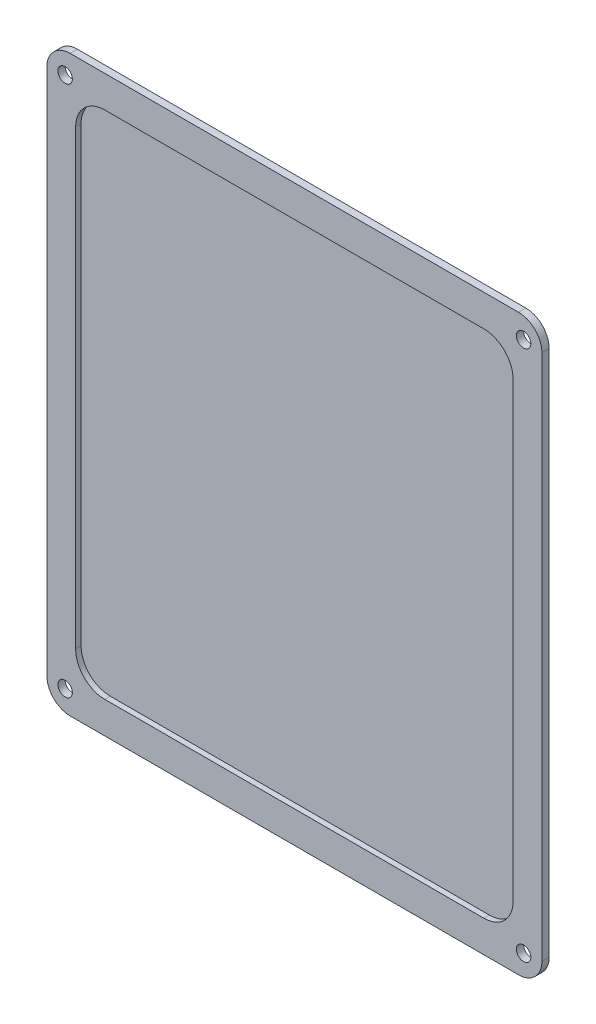
ISO-10303-21;
HEADER;
FILE_DESCRIPTION(('STEP AP214'),'2;1');
FILE_NAME('part.step','',(''),(''),'','','');
FILE_SCHEMA(('AUTOMOTIVE_DESIGN { 1 0 10303 214 1 1 1 1 }'));
ENDSEC;
DATA;
#1=APPLICATION_CONTEXT('core data for automotive mechanical design processes');
#2=APPLICATION_PROTOCOL_DEFINITION('international standard','automotive_design',2000,#1);
#3=PRODUCT_CONTEXT('',#1,'mechanical');
#4=PRODUCT('Part','Part','',(#3));
#5=PRODUCT_RELATED_PRODUCT_CATEGORY('part','',(#4));
#6=PRODUCT_DEFINITION_FORMATION('','',#4);
#7=PRODUCT_DEFINITION_CONTEXT('part definition',#1,'design');
#8=PRODUCT_DEFINITION('design','',#6,#7);
#9=PRODUCT_DEFINITION_SHAPE('','',#8);
#10=(LENGTH_UNIT() NAMED_UNIT(*) SI_UNIT(.MILLI.,.METRE.));
#11=(NAMED_UNIT(*) PLANE_ANGLE_UNIT() SI_UNIT($,.RADIAN.));
#12=(NAMED_UNIT(*) SI_UNIT($,.STERADIAN.) SOLID_ANGLE_UNIT());
#13=UNCERTAINTY_MEASURE_WITH_UNIT(LENGTH_MEASURE(1.E-05),#10,'distance_accuracy_value','');
#14=(GEOMETRIC_REPRESENTATION_CONTEXT(3) GLOBAL_UNCERTAINTY_ASSIGNED_CONTEXT((#13)) GLOBAL_UNIT_ASSIGNED_CONTEXT((#10,
#11,#12)) REPRESENTATION_CONTEXT('',''));
#15=CARTESIAN_POINT('',(0.,0.,0.));
#16=DIRECTION('',(0.,0.,1.));
#17=DIRECTION('',(1.,0.,0.));
#18=AXIS2_PLACEMENT_3D('',#15,#16,#17);
#19=CARTESIAN_POINT('',(0.,0.,0.));
#20=DIRECTION('',(0.,0.,1.));
#21=DIRECTION('',(1.,0.,0.));
#22=AXIS2_PLACEMENT_3D('',#19,#20,#21);
#23=PLANE('',#22);
#24=CARTESIAN_POINT('',(-49.911,-57.8485,0.));
#25=DIRECTION('',(0.,0.,1.));
#26=DIRECTION('',(1.,0.,0.));
#27=AXIS2_PLACEMENT_3D('',#24,#25,#26);
#28=CIRCLE('',#27,1.5748);
#29=CARTESIAN_POINT('',(-48.3362,-57.8485,0.));
#30=VERTEX_POINT('',#29);
#31=EDGE_CURVE('E226',#30,#30,#28,.T.);
#32=ORIENTED_EDGE('',*,*,#31,.T.);
#33=EDGE_LOOP('',(#32));
#34=FACE_BOUND('',#33,.T.);
#35=CARTESIAN_POINT('',(49.911,57.8485,0.));
#36=DIRECTION('',(0.,0.,1.));
#37=DIRECTION('',(1.,0.,0.));
#38=AXIS2_PLACEMENT_3D('',#35,#36,#37);
#39=CIRCLE('',#38,1.5748);
#40=CARTESIAN_POINT('',(51.4858,57.8485,0.));
#41=VERTEX_POINT('',#40);
#42=EDGE_CURVE('E233',#41,#41,#39,.T.);
#43=ORIENTED_EDGE('',*,*,#42,.T.);
#44=EDGE_LOOP('',(#43));
#45=FACE_BOUND('',#44,.T.);
#46=DIRECTION('',(1.,0.,0.));
#47=VECTOR('',#46,1.);
#48=CARTESIAN_POINT('',(53.8932238335263,-62.4640291505628,0.));
#49=LINE('',#48,#47);
#50=CARTESIAN_POINT('',(-48.8132238335262,-62.4640291505628,0.));
#51=VERTEX_POINT('',#50);
#52=CARTESIAN_POINT('',(48.8132238335263,-62.4640291505628,0.));
#53=VERTEX_POINT('',#52);
#54=EDGE_CURVE('E270',#51,#53,#49,.T.);
#55=ORIENTED_EDGE('',*,*,#54,.F.);
#56=CARTESIAN_POINT('',(-48.8132238335262,-57.3840291505628,0.));
#57=DIRECTION('',(0.,0.,1.));
#58=DIRECTION('',(1.,0.,0.));
#59=AXIS2_PLACEMENT_3D('',#56,#57,#58);
#60=CIRCLE('',#59,5.08);
#61=CARTESIAN_POINT('',(-53.8932238335262,-57.3840291505628,0.));
#62=VERTEX_POINT('',#61);
#63=EDGE_CURVE('E291',#51,#62,#60,.F.);
#64=ORIENTED_EDGE('',*,*,#63,.T.);
#65=DIRECTION('',(0.,-1.,0.));
#66=VECTOR('',#65,1.);
#67=CARTESIAN_POINT('',(-53.8932238335262,-62.4640291505628,0.));
#68=LINE('',#67,#66);
#69=CARTESIAN_POINT('',(-53.8932238335262,57.3840291505629,0.));
#70=VERTEX_POINT('',#69);
#71=EDGE_CURVE('E247',#70,#62,#68,.T.);
#72=ORIENTED_EDGE('',*,*,#71,.F.);
#73=CARTESIAN_POINT('',(-48.8132238335262,57.3840291505629,0.));
#74=DIRECTION('',(0.,0.,1.));
#75=DIRECTION('',(1.,0.,0.));
#76=AXIS2_PLACEMENT_3D('',#73,#74,#75);
#77=CIRCLE('',#76,5.08);
#78=CARTESIAN_POINT('',(-48.8132238335262,62.4640291505629,0.));
#79=VERTEX_POINT('',#78);
#80=EDGE_CURVE('E284',#70,#79,#77,.F.);
#81=ORIENTED_EDGE('',*,*,#80,.T.);
#82=DIRECTION('',(-1.,0.,0.));
#83=VECTOR('',#82,1.);
#84=CARTESIAN_POINT('',(53.8932238335263,62.4640291505629,0.));
#85=LINE('',#84,#83);
#86=CARTESIAN_POINT('',(48.8132238335263,62.4640291505629,0.));
#87=VERTEX_POINT('',#86);
#88=EDGE_CURVE('E255',#87,#79,#85,.T.);
#89=ORIENTED_EDGE('',*,*,#88,.F.);
#90=CARTESIAN_POINT('',(48.8132238335263,57.3840291505629,0.));
#91=DIRECTION('',(0.,0.,1.));
#92=DIRECTION('',(1.,0.,0.));
#93=AXIS2_PLACEMENT_3D('',#90,#91,#92);
#94=CIRCLE('',#93,5.08);
#95=CARTESIAN_POINT('',(53.8932238335263,57.3840291505629,0.));
#96=VERTEX_POINT('',#95);
#97=EDGE_CURVE('E286',#87,#96,#94,.F.);
#98=ORIENTED_EDGE('',*,*,#97,.T.);
#99=DIRECTION('',(0.,1.,0.));
#100=VECTOR('',#99,1.);
#101=CARTESIAN_POINT('',(53.8932238335263,-62.4640291505628,0.));
#102=LINE('',#101,#100);
#103=CARTESIAN_POINT('',(53.8932238335263,-57.3840291505628,0.));
#104=VERTEX_POINT('',#103);
#105=EDGE_CURVE('E273',#104,#96,#102,.T.);
#106=ORIENTED_EDGE('',*,*,#105,.F.);
#107=CARTESIAN_POINT('',(48.8132238335263,-57.3840291505628,0.));
#108=DIRECTION('',(0.,0.,1.));
#109=DIRECTION('',(1.,0.,0.));
#110=AXIS2_PLACEMENT_3D('',#107,#108,#109);
#111=CIRCLE('',#110,5.08);
#112=EDGE_CURVE('E289',#104,#53,#111,.F.);
#113=ORIENTED_EDGE('',*,*,#112,.T.);
#114=EDGE_LOOP('',(#55,#64,#72,#81,#89,#98,#106,#113));
#115=FACE_BOUND('',#114,.T.);
#116=CARTESIAN_POINT('',(-49.911,57.8485,0.));
#117=DIRECTION('',(0.,0.,1.));
#118=DIRECTION('',(1.,0.,0.));
#119=AXIS2_PLACEMENT_3D('',#116,#117,#118);
#120=CIRCLE('',#119,1.5748);
#121=CARTESIAN_POINT('',(-48.3362,57.8485,0.));
#122=VERTEX_POINT('',#121);
#123=EDGE_CURVE('E240',#122,#122,#120,.T.);
#124=ORIENTED_EDGE('',*,*,#123,.T.);
#125=EDGE_LOOP('',(#124));
#126=FACE_BOUND('',#125,.T.);
#127=CARTESIAN_POINT('',(49.911,-57.8485,0.));
#128=DIRECTION('',(0.,0.,1.));
#129=DIRECTION('',(1.,0.,0.));
#130=AXIS2_PLACEMENT_3D('',#127,#128,#129);
#131=CIRCLE('',#130,1.5748);
#132=CARTESIAN_POINT('',(51.4858,-57.8485,0.));
#133=VERTEX_POINT('',#132);
#134=EDGE_CURVE('E225',#133,#133,#131,.T.);
#135=ORIENTED_EDGE('',*,*,#134,.T.);
#136=EDGE_LOOP('',(#135));
#137=FACE_BOUND('',#136,.T.);
#138=CARTESIAN_POINT('',(41.275,49.2125,0.));
#139=DIRECTION('',(0.,0.,1.));
#140=DIRECTION('',(1.,0.,0.));
#141=AXIS2_PLACEMENT_3D('',#138,#139,#140);
#142=CIRCLE('',#141,6.35);
#143=CARTESIAN_POINT('',(41.275,55.5625,0.));
#144=VERTEX_POINT('',#143);
#145=CARTESIAN_POINT('',(47.625,49.2125,0.));
#146=VERTEX_POINT('',#145);
#147=EDGE_CURVE('E11',#144,#146,#142,.F.);
#148=ORIENTED_EDGE('',*,*,#147,.F.);
#149=DIRECTION('',(1.,0.,0.));
#150=VECTOR('',#149,1.);
#151=CARTESIAN_POINT('',(0.,55.5625,0.));
#152=LINE('',#151,#150);
#153=CARTESIAN_POINT('',(-41.275,55.5625,0.));
#154=VERTEX_POINT('',#153);
#155=EDGE_CURVE('E322',#154,#144,#152,.T.);
#156=ORIENTED_EDGE('',*,*,#155,.F.);
#157=CARTESIAN_POINT('',(-41.275,49.2125,0.));
#158=DIRECTION('',(0.,0.,1.));
#159=DIRECTION('',(1.,0.,0.));
#160=AXIS2_PLACEMENT_3D('',#157,#158,#159);
#161=CIRCLE('',#160,6.35);
#162=CARTESIAN_POINT('',(-47.625,49.2125,0.));
#163=VERTEX_POINT('',#162);
#164=EDGE_CURVE('E325',#163,#154,#161,.F.);
#165=ORIENTED_EDGE('',*,*,#164,.F.);
#166=DIRECTION('',(0.,1.,0.));
#167=VECTOR('',#166,1.);
#168=CARTESIAN_POINT('',(-47.625,0.,0.));
#169=LINE('',#168,#167);
#170=CARTESIAN_POINT('',(-47.625,-49.2125,0.));
#171=VERTEX_POINT('',#170);
#172=EDGE_CURVE('E328',#171,#163,#169,.T.);
#173=ORIENTED_EDGE('',*,*,#172,.F.);
#174=CARTESIAN_POINT('',(-41.275,-49.2125,0.));
#175=DIRECTION('',(0.,0.,1.));
#176=DIRECTION('',(1.,0.,0.));
#177=AXIS2_PLACEMENT_3D('',#174,#175,#176);
#178=CIRCLE('',#177,6.35);
#179=CARTESIAN_POINT('',(-41.275,-55.5625,0.));
#180=VERTEX_POINT('',#179);
#181=EDGE_CURVE('E331',#180,#171,#178,.F.);
#182=ORIENTED_EDGE('',*,*,#181,.F.);
#183=DIRECTION('',(-1.,0.,0.));
#184=VECTOR('',#183,1.);
#185=CARTESIAN_POINT('',(0.,-55.5625,0.));
#186=LINE('',#185,#184);
#187=CARTESIAN_POINT('',(41.275,-55.5625,0.));
#188=VERTEX_POINT('',#187);
#189=EDGE_CURVE('E334',#188,#180,#186,.T.);
#190=ORIENTED_EDGE('',*,*,#189,.F.);
#191=CARTESIAN_POINT('',(41.275,-49.2125,0.));
#192=DIRECTION('',(0.,0.,1.));
#193=DIRECTION('',(1.,0.,0.));
#194=AXIS2_PLACEMENT_3D('',#191,#192,#193);
#195=CIRCLE('',#194,6.35);
#196=CARTESIAN_POINT('',(47.625,-49.2125,0.));
#197=VERTEX_POINT('',#196);
#198=EDGE_CURVE('E337',#197,#188,#195,.F.);
#199=ORIENTED_EDGE('',*,*,#198,.F.);
#200=DIRECTION('',(0.,-1.,0.));
#201=VECTOR('',#200,1.);
#202=CARTESIAN_POINT('',(47.625,0.,0.));
#203=LINE('',#202,#201);
#204=EDGE_CURVE('E52',#146,#197,#203,.T.);
#205=ORIENTED_EDGE('',*,*,#204,.F.);
#206=EDGE_LOOP('',(#148,#156,#165,#173,#182,#190,#199,#205));
#207=FACE_BOUND('',#206,.T.);
#208=ADVANCED_FACE('F43',(#34,#45,#115,#126,#137,#207),#23,.F.);
#209=CARTESIAN_POINT('',(0.,0.,1.5875));
#210=DIRECTION('',(0.,0.,1.));
#211=DIRECTION('',(1.,0.,0.));
#212=AXIS2_PLACEMENT_3D('',#209,#210,#211);
#213=PLANE('',#212);
#214=CARTESIAN_POINT('',(41.275,49.2125,1.5875));
#215=DIRECTION('',(0.,0.,1.));
#216=DIRECTION('',(1.,0.,0.));
#217=AXIS2_PLACEMENT_3D('',#214,#215,#216);
#218=CIRCLE('',#217,6.35);
#219=CARTESIAN_POINT('',(47.625,49.2125,1.5875));
#220=VERTEX_POINT('',#219);
#221=CARTESIAN_POINT('',(41.2749999999999,55.5625,1.5875));
#222=VERTEX_POINT('',#221);
#223=EDGE_CURVE('E360',#220,#222,#218,.T.);
#224=ORIENTED_EDGE('',*,*,#223,.F.);
#225=DIRECTION('',(0.,1.,0.));
#226=VECTOR('',#225,1.);
#227=CARTESIAN_POINT('',(47.625,49.2125,1.5875));
#228=LINE('',#227,#226);
#229=CARTESIAN_POINT('',(47.625,-49.2124999999999,1.5875));
#230=VERTEX_POINT('',#229);
#231=EDGE_CURVE('E221',#230,#220,#228,.T.);
#232=ORIENTED_EDGE('',*,*,#231,.F.);
#233=CARTESIAN_POINT('',(41.275,-49.2125,1.5875));
#234=DIRECTION('',(0.,0.,1.));
#235=DIRECTION('',(1.,0.,0.));
#236=AXIS2_PLACEMENT_3D('',#233,#234,#235);
#237=CIRCLE('',#236,6.35);
#238=CARTESIAN_POINT('',(41.275,-55.5625,1.5875));
#239=VERTEX_POINT('',#238);
#240=EDGE_CURVE('E384',#239,#230,#237,.T.);
#241=ORIENTED_EDGE('',*,*,#240,.F.);
#242=DIRECTION('',(1.,0.,0.));
#243=VECTOR('',#242,1.);
#244=CARTESIAN_POINT('',(41.275,-55.5625,1.5875));
#245=LINE('',#244,#243);
#246=CARTESIAN_POINT('',(-41.2749999999999,-55.5625,1.5875));
#247=VERTEX_POINT('',#246);
#248=EDGE_CURVE('E381',#247,#239,#245,.T.);
#249=ORIENTED_EDGE('',*,*,#248,.F.);
#250=CARTESIAN_POINT('',(-41.275,-49.2125,1.5875));
#251=DIRECTION('',(0.,0.,1.));
#252=DIRECTION('',(1.,0.,0.));
#253=AXIS2_PLACEMENT_3D('',#250,#251,#252);
#254=CIRCLE('',#253,6.35);
#255=CARTESIAN_POINT('',(-47.625,-49.2125,1.5875));
#256=VERTEX_POINT('',#255);
#257=EDGE_CURVE('E354',#256,#247,#254,.T.);
#258=ORIENTED_EDGE('',*,*,#257,.F.);
#259=DIRECTION('',(0.,-1.,0.));
#260=VECTOR('',#259,1.);
#261=CARTESIAN_POINT('',(-47.625,49.2124999999999,1.5875));
#262=LINE('',#261,#260);
#263=CARTESIAN_POINT('',(-47.625,49.2124999999999,1.5875));
#264=VERTEX_POINT('',#263);
#265=EDGE_CURVE('E207',#264,#256,#262,.T.);
#266=ORIENTED_EDGE('',*,*,#265,.F.);
#267=CARTESIAN_POINT('',(-41.275,49.2125,1.5875));
#268=DIRECTION('',(0.,0.,1.));
#269=DIRECTION('',(1.,0.,0.));
#270=AXIS2_PLACEMENT_3D('',#267,#268,#269);
#271=CIRCLE('',#270,6.35);
#272=CARTESIAN_POINT('',(-41.275,55.5625,1.5875));
#273=VERTEX_POINT('',#272);
#274=EDGE_CURVE('E355',#273,#264,#271,.T.);
#275=ORIENTED_EDGE('',*,*,#274,.F.);
#276=DIRECTION('',(-1.,0.,0.));
#277=VECTOR('',#276,1.);
#278=CARTESIAN_POINT('',(41.2749999999999,55.5625,1.5875));
#279=LINE('',#278,#277);
#280=EDGE_CURVE('E363',#222,#273,#279,.T.);
#281=ORIENTED_EDGE('',*,*,#280,.F.);
#282=EDGE_LOOP('',(#224,#232,#241,#249,#258,#266,#275,#281));
#283=FACE_BOUND('',#282,.T.);
#284=CARTESIAN_POINT('',(49.911,-57.8485,1.5875));
#285=DIRECTION('',(0.,0.,1.));
#286=DIRECTION('',(1.,0.,0.));
#287=AXIS2_PLACEMENT_3D('',#284,#285,#286);
#288=CIRCLE('',#287,1.5748);
#289=CARTESIAN_POINT('',(51.4858,-57.8485,1.5875));
#290=VERTEX_POINT('',#289);
#291=EDGE_CURVE('E230',#290,#290,#288,.T.);
#292=ORIENTED_EDGE('',*,*,#291,.F.);
#293=EDGE_LOOP('',(#292));
#294=FACE_BOUND('',#293,.T.);
#295=CARTESIAN_POINT('',(-49.911,57.8485,1.5875));
#296=DIRECTION('',(0.,0.,1.));
#297=DIRECTION('',(1.,0.,0.));
#298=AXIS2_PLACEMENT_3D('',#295,#296,#297);
#299=CIRCLE('',#298,1.5748);
#300=CARTESIAN_POINT('',(-48.3362,57.8485,1.5875));
#301=VERTEX_POINT('',#300);
#302=EDGE_CURVE('E244',#301,#301,#299,.T.);
#303=ORIENTED_EDGE('',*,*,#302,.F.);
#304=EDGE_LOOP('',(#303));
#305=FACE_BOUND('',#304,.T.);
#306=DIRECTION('',(0.,-1.,0.));
#307=VECTOR('',#306,1.);
#308=CARTESIAN_POINT('',(-53.8932238335262,-62.4640291505628,1.5875));
#309=LINE('',#308,#307);
#310=CARTESIAN_POINT('',(-53.8932238335262,57.3840291505629,1.5875));
#311=VERTEX_POINT('',#310);
#312=CARTESIAN_POINT('',(-53.8932238335262,-57.3840291505628,1.5875));
#313=VERTEX_POINT('',#312);
#314=EDGE_CURVE('E250',#311,#313,#309,.T.);
#315=ORIENTED_EDGE('',*,*,#314,.T.);
#316=CARTESIAN_POINT('',(-48.8132238335262,-57.3840291505628,1.5875));
#317=DIRECTION('',(0.,0.,1.));
#318=DIRECTION('',(1.,0.,0.));
#319=AXIS2_PLACEMENT_3D('',#316,#317,#318);
#320=CIRCLE('',#319,5.08);
#321=CARTESIAN_POINT('',(-48.8132238335262,-62.4640291505628,1.5875));
#322=VERTEX_POINT('',#321);
#323=EDGE_CURVE('E305',#313,#322,#320,.T.);
#324=ORIENTED_EDGE('',*,*,#323,.T.);
#325=DIRECTION('',(1.,0.,0.));
#326=VECTOR('',#325,1.);
#327=CARTESIAN_POINT('',(53.8932238335263,-62.4640291505628,1.5875));
#328=LINE('',#327,#326);
#329=CARTESIAN_POINT('',(48.8132238335263,-62.4640291505628,1.5875));
#330=VERTEX_POINT('',#329);
#331=EDGE_CURVE('E254',#322,#330,#328,.T.);
#332=ORIENTED_EDGE('',*,*,#331,.T.);
#333=CARTESIAN_POINT('',(48.8132238335263,-57.3840291505628,1.5875));
#334=DIRECTION('',(0.,0.,1.));
#335=DIRECTION('',(1.,0.,0.));
#336=AXIS2_PLACEMENT_3D('',#333,#334,#335);
#337=CIRCLE('',#336,5.08);
#338=CARTESIAN_POINT('',(53.8932238335263,-57.3840291505628,1.5875));
#339=VERTEX_POINT('',#338);
#340=EDGE_CURVE('E303',#330,#339,#337,.T.);
#341=ORIENTED_EDGE('',*,*,#340,.T.);
#342=DIRECTION('',(0.,1.,0.));
#343=VECTOR('',#342,1.);
#344=CARTESIAN_POINT('',(53.8932238335263,-62.4640291505628,1.5875));
#345=LINE('',#344,#343);
#346=CARTESIAN_POINT('',(53.8932238335263,57.3840291505629,1.5875));
#347=VERTEX_POINT('',#346);
#348=EDGE_CURVE('E258',#339,#347,#345,.T.);
#349=ORIENTED_EDGE('',*,*,#348,.T.);
#350=CARTESIAN_POINT('',(48.8132238335263,57.3840291505629,1.5875));
#351=DIRECTION('',(0.,0.,1.));
#352=DIRECTION('',(1.,0.,0.));
#353=AXIS2_PLACEMENT_3D('',#350,#351,#352);
#354=CIRCLE('',#353,5.08);
#355=CARTESIAN_POINT('',(48.8132238335263,62.4640291505629,1.5875));
#356=VERTEX_POINT('',#355);
#357=EDGE_CURVE('E300',#347,#356,#354,.T.);
#358=ORIENTED_EDGE('',*,*,#357,.T.);
#359=DIRECTION('',(-1.,0.,0.));
#360=VECTOR('',#359,1.);
#361=CARTESIAN_POINT('',(53.8932238335263,62.4640291505629,1.5875));
#362=LINE('',#361,#360);
#363=CARTESIAN_POINT('',(-48.8132238335262,62.4640291505629,1.5875));
#364=VERTEX_POINT('',#363);
#365=EDGE_CURVE('E262',#356,#364,#362,.T.);
#366=ORIENTED_EDGE('',*,*,#365,.T.);
#367=CARTESIAN_POINT('',(-48.8132238335262,57.3840291505629,1.5875));
#368=DIRECTION('',(0.,0.,1.));
#369=DIRECTION('',(1.,0.,0.));
#370=AXIS2_PLACEMENT_3D('',#367,#368,#369);
#371=CIRCLE('',#370,5.08);
#372=EDGE_CURVE('E298',#364,#311,#371,.T.);
#373=ORIENTED_EDGE('',*,*,#372,.T.);
#374=EDGE_LOOP('',(#315,#324,#332,#341,#349,#358,#366,#373));
#375=FACE_BOUND('',#374,.T.);
#376=CARTESIAN_POINT('',(49.911,57.8485,1.5875));
#377=DIRECTION('',(0.,0.,1.));
#378=DIRECTION('',(1.,0.,0.));
#379=AXIS2_PLACEMENT_3D('',#376,#377,#378);
#380=CIRCLE('',#379,1.5748);
#381=CARTESIAN_POINT('',(51.4858,57.8485,1.5875));
#382=VERTEX_POINT('',#381);
#383=EDGE_CURVE('E236',#382,#382,#380,.T.);
#384=ORIENTED_EDGE('',*,*,#383,.F.);
#385=EDGE_LOOP('',(#384));
#386=FACE_BOUND('',#385,.T.);
#387=CARTESIAN_POINT('',(-49.911,-57.8485,1.5875));
#388=DIRECTION('',(0.,0.,1.));
#389=DIRECTION('',(1.,0.,0.));
#390=AXIS2_PLACEMENT_3D('',#387,#388,#389);
#391=CIRCLE('',#390,1.5748);
#392=CARTESIAN_POINT('',(-48.3362,-57.8485,1.5875));
#393=VERTEX_POINT('',#392);
#394=EDGE_CURVE('E222',#393,#393,#391,.T.);
#395=ORIENTED_EDGE('',*,*,#394,.F.);
#396=EDGE_LOOP('',(#395));
#397=FACE_BOUND('',#396,.T.);
#398=ADVANCED_FACE('F401',(#283,#294,#305,#375,#386,#397),#213,.T.);
#399=ORIENTED_EDGE('',*,*,#155,.T.);
#400=ORIENTED_EDGE('',*,*,#147,.T.);
#401=ORIENTED_EDGE('',*,*,#204,.T.);
#402=ORIENTED_EDGE('',*,*,#198,.T.);
#403=ORIENTED_EDGE('',*,*,#189,.T.);
#404=ORIENTED_EDGE('',*,*,#181,.T.);
#405=ORIENTED_EDGE('',*,*,#172,.T.);
#406=ORIENTED_EDGE('',*,*,#164,.T.);
#407=EDGE_LOOP('',(#399,#400,#401,#402,#403,#404,#405,#406));
#408=FACE_BOUND('',#407,.T.);
#409=ADVANCED_FACE('F432',(#408),#23,.F.);
#410=CARTESIAN_POINT('',(-53.8932238335262,-62.4640291505628,1.5875));
#411=DIRECTION('',(1.,0.,0.));
#412=DIRECTION('',(0.,0.,-1.));
#413=AXIS2_PLACEMENT_3D('',#410,#411,#412);
#414=PLANE('',#413);
#415=ORIENTED_EDGE('',*,*,#71,.T.);
#416=DIRECTION('',(0.,0.,-1.));
#417=VECTOR('',#416,1.);
#418=CARTESIAN_POINT('',(-53.8932238335262,-57.3840291505628,1.5875));
#419=LINE('',#418,#417);
#420=EDGE_CURVE('E296',#62,#313,#419,.F.);
#421=ORIENTED_EDGE('',*,*,#420,.T.);
#422=ORIENTED_EDGE('',*,*,#314,.F.);
#423=DIRECTION('',(0.,0.,-1.));
#424=VECTOR('',#423,1.);
#425=CARTESIAN_POINT('',(-53.8932238335262,57.3840291505629,1.5875));
#426=LINE('',#425,#424);
#427=EDGE_CURVE('E293',#311,#70,#426,.T.);
#428=ORIENTED_EDGE('',*,*,#427,.T.);
#429=EDGE_LOOP('',(#415,#421,#422,#428));
#430=FACE_BOUND('',#429,.T.);
#431=ADVANCED_FACE('F440',(#430),#414,.F.);
#432=CARTESIAN_POINT('',(53.8932238335263,-62.4640291505628,1.5875));
#433=DIRECTION('',(0.,1.,0.));
#434=DIRECTION('',(0.,0.,1.));
#435=AXIS2_PLACEMENT_3D('',#432,#433,#434);
#436=PLANE('',#435);
#437=ORIENTED_EDGE('',*,*,#331,.F.);
#438=DIRECTION('',(0.,0.,-1.));
#439=VECTOR('',#438,1.);
#440=CARTESIAN_POINT('',(-48.8132238335262,-62.4640291505628,1.5875));
#441=LINE('',#440,#439);
#442=EDGE_CURVE('E281',#322,#51,#441,.T.);
#443=ORIENTED_EDGE('',*,*,#442,.T.);
#444=ORIENTED_EDGE('',*,*,#54,.T.);
#445=DIRECTION('',(0.,0.,-1.));
#446=VECTOR('',#445,1.);
#447=CARTESIAN_POINT('',(48.8132238335263,-62.4640291505628,1.5875));
#448=LINE('',#447,#446);
#449=EDGE_CURVE('E266',#53,#330,#448,.F.);
#450=ORIENTED_EDGE('',*,*,#449,.T.);
#451=EDGE_LOOP('',(#437,#443,#444,#450));
#452=FACE_BOUND('',#451,.T.);
#453=ADVANCED_FACE('F444',(#452),#436,.F.);
#454=CARTESIAN_POINT('',(53.8932238335263,-62.4640291505628,1.5875));
#455=DIRECTION('',(-1.,0.,0.));
#456=DIRECTION('',(0.,0.,1.));
#457=AXIS2_PLACEMENT_3D('',#454,#455,#456);
#458=PLANE('',#457);
#459=ORIENTED_EDGE('',*,*,#348,.F.);
#460=DIRECTION('',(0.,0.,-1.));
#461=VECTOR('',#460,1.);
#462=CARTESIAN_POINT('',(53.8932238335263,-57.3840291505628,1.5875));
#463=LINE('',#462,#461);
#464=EDGE_CURVE('E310',#339,#104,#463,.T.);
#465=ORIENTED_EDGE('',*,*,#464,.T.);
#466=ORIENTED_EDGE('',*,*,#105,.T.);
#467=DIRECTION('',(0.,0.,-1.));
#468=VECTOR('',#467,1.);
#469=CARTESIAN_POINT('',(53.8932238335263,57.3840291505629,1.5875));
#470=LINE('',#469,#468);
#471=EDGE_CURVE('E307',#96,#347,#470,.F.);
#472=ORIENTED_EDGE('',*,*,#471,.T.);
#473=EDGE_LOOP('',(#459,#465,#466,#472));
#474=FACE_BOUND('',#473,.T.);
#475=ADVANCED_FACE('F456',(#474),#458,.F.);
#476=CARTESIAN_POINT('',(53.8932238335263,62.4640291505629,1.5875));
#477=DIRECTION('',(0.,-1.,0.));
#478=DIRECTION('',(0.,0.,-1.));
#479=AXIS2_PLACEMENT_3D('',#476,#477,#478);
#480=PLANE('',#479);
#481=ORIENTED_EDGE('',*,*,#365,.F.);
#482=DIRECTION('',(0.,0.,-1.));
#483=VECTOR('',#482,1.);
#484=CARTESIAN_POINT('',(48.8132238335263,62.4640291505629,1.5875));
#485=LINE('',#484,#483);
#486=EDGE_CURVE('E315',#356,#87,#485,.T.);
#487=ORIENTED_EDGE('',*,*,#486,.T.);
#488=ORIENTED_EDGE('',*,*,#88,.T.);
#489=DIRECTION('',(0.,0.,-1.));
#490=VECTOR('',#489,1.);
#491=CARTESIAN_POINT('',(-48.8132238335262,62.4640291505629,1.5875));
#492=LINE('',#491,#490);
#493=EDGE_CURVE('E313',#79,#364,#492,.F.);
#494=ORIENTED_EDGE('',*,*,#493,.T.);
#495=EDGE_LOOP('',(#481,#487,#488,#494));
#496=FACE_BOUND('',#495,.T.);
#497=ADVANCED_FACE('F482',(#496),#480,.F.);
#498=CARTESIAN_POINT('',(-49.911,57.8485,1.5875));
#499=DIRECTION('',(0.,0.,-1.));
#500=DIRECTION('',(-1.,0.,0.));
#501=AXIS2_PLACEMENT_3D('',#498,#499,#500);
#502=CYLINDRICAL_SURFACE('',#501,1.5748);
#503=ORIENTED_EDGE('',*,*,#302,.T.);
#504=EDGE_LOOP('',(#503));
#505=FACE_BOUND('',#504,.T.);
#506=ORIENTED_EDGE('',*,*,#123,.F.);
#507=EDGE_LOOP('',(#506));
#508=FACE_BOUND('',#507,.T.);
#509=ADVANCED_FACE('F514',(#505,#508),#502,.F.);
#510=CARTESIAN_POINT('',(49.911,57.8485,1.5875));
#511=DIRECTION('',(0.,0.,-1.));
#512=DIRECTION('',(-1.,0.,0.));
#513=AXIS2_PLACEMENT_3D('',#510,#511,#512);
#514=CYLINDRICAL_SURFACE('',#513,1.5748);
#515=ORIENTED_EDGE('',*,*,#383,.T.);
#516=EDGE_LOOP('',(#515));
#517=FACE_BOUND('',#516,.T.);
#518=ORIENTED_EDGE('',*,*,#42,.F.);
#519=EDGE_LOOP('',(#518));
#520=FACE_BOUND('',#519,.T.);
#521=ADVANCED_FACE('F506',(#517,#520),#514,.F.);
#522=CARTESIAN_POINT('',(49.911,-57.8485,1.5875));
#523=DIRECTION('',(0.,0.,-1.));
#524=DIRECTION('',(-1.,0.,0.));
#525=AXIS2_PLACEMENT_3D('',#522,#523,#524);
#526=CYLINDRICAL_SURFACE('',#525,1.5748);
#527=ORIENTED_EDGE('',*,*,#291,.T.);
#528=EDGE_LOOP('',(#527));
#529=FACE_BOUND('',#528,.T.);
#530=ORIENTED_EDGE('',*,*,#134,.F.);
#531=EDGE_LOOP('',(#530));
#532=FACE_BOUND('',#531,.T.);
#533=ADVANCED_FACE('F504',(#529,#532),#526,.F.);
#534=CARTESIAN_POINT('',(-49.911,-57.8485,1.5875));
#535=DIRECTION('',(0.,0.,-1.));
#536=DIRECTION('',(-1.,0.,0.));
#537=AXIS2_PLACEMENT_3D('',#534,#535,#536);
#538=CYLINDRICAL_SURFACE('',#537,1.5748);
#539=ORIENTED_EDGE('',*,*,#394,.T.);
#540=EDGE_LOOP('',(#539));
#541=FACE_BOUND('',#540,.T.);
#542=ORIENTED_EDGE('',*,*,#31,.F.);
#543=EDGE_LOOP('',(#542));
#544=FACE_BOUND('',#543,.T.);
#545=ADVANCED_FACE('F465',(#541,#544),#538,.F.);
#546=CARTESIAN_POINT('',(-48.8132238335262,-57.3840291505628,1.5875));
#547=DIRECTION('',(0.,0.,-1.));
#548=DIRECTION('',(-1.,0.,0.));
#549=AXIS2_PLACEMENT_3D('',#546,#547,#548);
#550=CYLINDRICAL_SURFACE('',#549,5.08);
#551=ORIENTED_EDGE('',*,*,#323,.F.);
#552=ORIENTED_EDGE('',*,*,#420,.F.);
#553=ORIENTED_EDGE('',*,*,#63,.F.);
#554=ORIENTED_EDGE('',*,*,#442,.F.);
#555=EDGE_LOOP('',(#551,#552,#553,#554));
#556=FACE_BOUND('',#555,.T.);
#557=ADVANCED_FACE('F461',(#556),#550,.T.);
#558=CARTESIAN_POINT('',(48.8132238335263,-57.3840291505628,1.5875));
#559=DIRECTION('',(0.,0.,-1.));
#560=DIRECTION('',(-1.,0.,0.));
#561=AXIS2_PLACEMENT_3D('',#558,#559,#560);
#562=CYLINDRICAL_SURFACE('',#561,5.08);
#563=ORIENTED_EDGE('',*,*,#340,.F.);
#564=ORIENTED_EDGE('',*,*,#449,.F.);
#565=ORIENTED_EDGE('',*,*,#112,.F.);
#566=ORIENTED_EDGE('',*,*,#464,.F.);
#567=EDGE_LOOP('',(#563,#564,#565,#566));
#568=FACE_BOUND('',#567,.T.);
#569=ADVANCED_FACE('F464',(#568),#562,.T.);
#570=CARTESIAN_POINT('',(48.8132238335263,57.3840291505629,1.5875));
#571=DIRECTION('',(0.,0.,-1.));
#572=DIRECTION('',(-1.,0.,0.));
#573=AXIS2_PLACEMENT_3D('',#570,#571,#572);
#574=CYLINDRICAL_SURFACE('',#573,5.08);
#575=ORIENTED_EDGE('',*,*,#357,.F.);
#576=ORIENTED_EDGE('',*,*,#471,.F.);
#577=ORIENTED_EDGE('',*,*,#97,.F.);
#578=ORIENTED_EDGE('',*,*,#486,.F.);
#579=EDGE_LOOP('',(#575,#576,#577,#578));
#580=FACE_BOUND('',#579,.T.);
#581=ADVANCED_FACE('F425',(#580),#574,.T.);
#582=CARTESIAN_POINT('',(-48.8132238335262,57.3840291505629,1.5875));
#583=DIRECTION('',(0.,0.,-1.));
#584=DIRECTION('',(-1.,0.,0.));
#585=AXIS2_PLACEMENT_3D('',#582,#583,#584);
#586=CYLINDRICAL_SURFACE('',#585,5.08);
#587=ORIENTED_EDGE('',*,*,#372,.F.);
#588=ORIENTED_EDGE('',*,*,#493,.F.);
#589=ORIENTED_EDGE('',*,*,#80,.F.);
#590=ORIENTED_EDGE('',*,*,#427,.F.);
#591=EDGE_LOOP('',(#587,#588,#589,#590));
#592=FACE_BOUND('',#591,.T.);
#593=ADVANCED_FACE('F45',(#592),#586,.T.);
#594=CARTESIAN_POINT('',(41.275,49.2125,0.));
#595=DIRECTION('',(0.,0.,1.));
#596=DIRECTION('',(1.,0.,0.));
#597=AXIS2_PLACEMENT_3D('',#594,#595,#596);
#598=CYLINDRICAL_SURFACE('',#597,6.35);
#599=DIRECTION('',(0.,0.,1.));
#600=VECTOR('',#599,1.);
#601=CARTESIAN_POINT('',(41.2749999999999,55.5625,0.));
#602=LINE('',#601,#600);
#603=CARTESIAN_POINT('',(41.2749999999999,55.5625,0.396875));
#604=VERTEX_POINT('',#603);
#605=EDGE_CURVE('E218',#604,#222,#602,.T.);
#606=ORIENTED_EDGE('',*,*,#605,.F.);
#607=CARTESIAN_POINT('',(41.275,49.2125,0.396875));
#608=DIRECTION('',(0.,0.,1.));
#609=DIRECTION('',(1.,0.,0.));
#610=AXIS2_PLACEMENT_3D('',#607,#608,#609);
#611=CIRCLE('',#610,6.35);
#612=CARTESIAN_POINT('',(47.625,49.2125,0.396875));
#613=VERTEX_POINT('',#612);
#614=EDGE_CURVE('E357',#604,#613,#611,.F.);
#615=ORIENTED_EDGE('',*,*,#614,.T.);
#616=DIRECTION('',(0.,0.,1.));
#617=VECTOR('',#616,1.);
#618=CARTESIAN_POINT('',(47.625,49.2125,0.));
#619=LINE('',#618,#617);
#620=EDGE_CURVE('E229',#613,#220,#619,.T.);
#621=ORIENTED_EDGE('',*,*,#620,.T.);
#622=ORIENTED_EDGE('',*,*,#223,.T.);
#623=EDGE_LOOP('',(#606,#615,#621,#622));
#624=FACE_BOUND('',#623,.T.);
#625=ADVANCED_FACE('F417',(#624),#598,.F.);
#626=CARTESIAN_POINT('',(47.625,49.2125,0.));
#627=DIRECTION('',(1.,0.,0.));
#628=DIRECTION('',(0.,1.,0.));
#629=AXIS2_PLACEMENT_3D('',#626,#627,#628);
#630=PLANE('',#629);
#631=ORIENTED_EDGE('',*,*,#620,.F.);
#632=DIRECTION('',(0.,-1.,0.));
#633=VECTOR('',#632,1.);
#634=CARTESIAN_POINT('',(47.625,-55.5625,0.396875));
#635=LINE('',#634,#633);
#636=CARTESIAN_POINT('',(47.625,-49.2125,0.396875));
#637=VERTEX_POINT('',#636);
#638=EDGE_CURVE('E194',#613,#637,#635,.T.);
#639=ORIENTED_EDGE('',*,*,#638,.T.);
#640=DIRECTION('',(0.,0.,1.));
#641=VECTOR('',#640,1.);
#642=CARTESIAN_POINT('',(47.625,-49.2124999999999,0.));
#643=LINE('',#642,#641);
#644=EDGE_CURVE('E366',#637,#230,#643,.T.);
#645=ORIENTED_EDGE('',*,*,#644,.T.);
#646=ORIENTED_EDGE('',*,*,#231,.T.);
#647=EDGE_LOOP('',(#631,#639,#645,#646));
#648=FACE_BOUND('',#647,.T.);
#649=ADVANCED_FACE('F405',(#648),#630,.F.);
#650=CARTESIAN_POINT('',(41.275,-49.2125,0.));
#651=DIRECTION('',(0.,0.,1.));
#652=DIRECTION('',(1.,0.,0.));
#653=AXIS2_PLACEMENT_3D('',#650,#651,#652);
#654=CYLINDRICAL_SURFACE('',#653,6.35);
#655=ORIENTED_EDGE('',*,*,#644,.F.);
#656=CARTESIAN_POINT('',(41.275,-49.2125,0.396875));
#657=DIRECTION('',(0.,0.,1.));
#658=DIRECTION('',(1.,0.,0.));
#659=AXIS2_PLACEMENT_3D('',#656,#657,#658);
#660=CIRCLE('',#659,6.35);
#661=CARTESIAN_POINT('',(41.275,-55.5625,0.396875));
#662=VERTEX_POINT('',#661);
#663=EDGE_CURVE('E203',#637,#662,#660,.F.);
#664=ORIENTED_EDGE('',*,*,#663,.T.);
#665=DIRECTION('',(0.,0.,1.));
#666=VECTOR('',#665,1.);
#667=CARTESIAN_POINT('',(41.275,-55.5625,0.));
#668=LINE('',#667,#666);
#669=EDGE_CURVE('E211',#662,#239,#668,.T.);
#670=ORIENTED_EDGE('',*,*,#669,.T.);
#671=ORIENTED_EDGE('',*,*,#240,.T.);
#672=EDGE_LOOP('',(#655,#664,#670,#671));
#673=FACE_BOUND('',#672,.T.);
#674=ADVANCED_FACE('F393',(#673),#654,.F.);
#675=CARTESIAN_POINT('',(41.275,-55.5625,0.));
#676=DIRECTION('',(0.,-1.,0.));
#677=DIRECTION('',(1.,0.,0.));
#678=AXIS2_PLACEMENT_3D('',#675,#676,#677);
#679=PLANE('',#678);
#680=ORIENTED_EDGE('',*,*,#669,.F.);
#681=DIRECTION('',(-1.,0.,0.));
#682=VECTOR('',#681,1.);
#683=CARTESIAN_POINT('',(47.625,-55.5625,0.396875));
#684=LINE('',#683,#682);
#685=CARTESIAN_POINT('',(-41.275,-55.5625,0.396875));
#686=VERTEX_POINT('',#685);
#687=EDGE_CURVE('E407',#662,#686,#684,.T.);
#688=ORIENTED_EDGE('',*,*,#687,.T.);
#689=DIRECTION('',(0.,0.,1.));
#690=VECTOR('',#689,1.);
#691=CARTESIAN_POINT('',(-41.2749999999999,-55.5625,0.));
#692=LINE('',#691,#690);
#693=EDGE_CURVE('E202',#686,#247,#692,.T.);
#694=ORIENTED_EDGE('',*,*,#693,.T.);
#695=ORIENTED_EDGE('',*,*,#248,.T.);
#696=EDGE_LOOP('',(#680,#688,#694,#695));
#697=FACE_BOUND('',#696,.T.);
#698=ADVANCED_FACE('F398',(#697),#679,.F.);
#699=CARTESIAN_POINT('',(-41.275,-49.2125,0.));
#700=DIRECTION('',(0.,0.,1.));
#701=DIRECTION('',(1.,0.,0.));
#702=AXIS2_PLACEMENT_3D('',#699,#700,#701);
#703=CYLINDRICAL_SURFACE('',#702,6.35);
#704=ORIENTED_EDGE('',*,*,#693,.F.);
#705=CARTESIAN_POINT('',(-41.275,-49.2125,0.396875));
#706=DIRECTION('',(0.,0.,1.));
#707=DIRECTION('',(1.,0.,0.));
#708=AXIS2_PLACEMENT_3D('',#705,#706,#707);
#709=CIRCLE('',#708,6.35);
#710=CARTESIAN_POINT('',(-47.625,-49.2125,0.396875));
#711=VERTEX_POINT('',#710);
#712=EDGE_CURVE('E186',#686,#711,#709,.F.);
#713=ORIENTED_EDGE('',*,*,#712,.T.);
#714=DIRECTION('',(0.,0.,1.));
#715=VECTOR('',#714,1.);
#716=CARTESIAN_POINT('',(-47.625,-49.2125,0.));
#717=LINE('',#716,#715);
#718=EDGE_CURVE('E200',#711,#256,#717,.T.);
#719=ORIENTED_EDGE('',*,*,#718,.T.);
#720=ORIENTED_EDGE('',*,*,#257,.T.);
#721=EDGE_LOOP('',(#704,#713,#719,#720));
#722=FACE_BOUND('',#721,.T.);
#723=ADVANCED_FACE('F198',(#722),#703,.F.);
#724=CARTESIAN_POINT('',(-47.625,49.2124999999999,0.));
#725=DIRECTION('',(-1.,0.,0.));
#726=DIRECTION('',(0.,-1.,0.));
#727=AXIS2_PLACEMENT_3D('',#724,#725,#726);
#728=PLANE('',#727);
#729=ORIENTED_EDGE('',*,*,#718,.F.);
#730=DIRECTION('',(0.,1.,0.));
#731=VECTOR('',#730,1.);
#732=CARTESIAN_POINT('',(-47.625,-55.5625,0.396875));
#733=LINE('',#732,#731);
#734=CARTESIAN_POINT('',(-47.625,49.2125,0.396875));
#735=VERTEX_POINT('',#734);
#736=EDGE_CURVE('E183',#711,#735,#733,.T.);
#737=ORIENTED_EDGE('',*,*,#736,.T.);
#738=DIRECTION('',(0.,0.,1.));
#739=VECTOR('',#738,1.);
#740=CARTESIAN_POINT('',(-47.625,49.2124999999999,0.));
#741=LINE('',#740,#739);
#742=EDGE_CURVE('E209',#735,#264,#741,.T.);
#743=ORIENTED_EDGE('',*,*,#742,.T.);
#744=ORIENTED_EDGE('',*,*,#265,.T.);
#745=EDGE_LOOP('',(#729,#737,#743,#744));
#746=FACE_BOUND('',#745,.T.);
#747=ADVANCED_FACE('F205',(#746),#728,.F.);
#748=CARTESIAN_POINT('',(-41.275,49.2125,0.));
#749=DIRECTION('',(0.,0.,1.));
#750=DIRECTION('',(1.,0.,0.));
#751=AXIS2_PLACEMENT_3D('',#748,#749,#750);
#752=CYLINDRICAL_SURFACE('',#751,6.35);
#753=ORIENTED_EDGE('',*,*,#742,.F.);
#754=CARTESIAN_POINT('',(-41.275,49.2125,0.396875));
#755=DIRECTION('',(0.,0.,1.));
#756=DIRECTION('',(1.,0.,0.));
#757=AXIS2_PLACEMENT_3D('',#754,#755,#756);
#758=CIRCLE('',#757,6.35);
#759=CARTESIAN_POINT('',(-41.275,55.5625,0.396875));
#760=VERTEX_POINT('',#759);
#761=EDGE_CURVE('E189',#735,#760,#758,.F.);
#762=ORIENTED_EDGE('',*,*,#761,.T.);
#763=DIRECTION('',(0.,0.,1.));
#764=VECTOR('',#763,1.);
#765=CARTESIAN_POINT('',(-41.275,55.5625,0.));
#766=LINE('',#765,#764);
#767=EDGE_CURVE('E213',#760,#273,#766,.T.);
#768=ORIENTED_EDGE('',*,*,#767,.T.);
#769=ORIENTED_EDGE('',*,*,#274,.T.);
#770=EDGE_LOOP('',(#753,#762,#768,#769));
#771=FACE_BOUND('',#770,.T.);
#772=ADVANCED_FACE('F413',(#771),#752,.F.);
#773=CARTESIAN_POINT('',(41.2749999999999,55.5625,0.));
#774=DIRECTION('',(0.,1.,0.));
#775=DIRECTION('',(-1.,0.,0.));
#776=AXIS2_PLACEMENT_3D('',#773,#774,#775);
#777=PLANE('',#776);
#778=ORIENTED_EDGE('',*,*,#767,.F.);
#779=DIRECTION('',(1.,0.,0.));
#780=VECTOR('',#779,1.);
#781=CARTESIAN_POINT('',(41.2749999999999,55.5625,0.396875));
#782=LINE('',#781,#780);
#783=EDGE_CURVE('E318',#760,#604,#782,.T.);
#784=ORIENTED_EDGE('',*,*,#783,.T.);
#785=ORIENTED_EDGE('',*,*,#605,.T.);
#786=ORIENTED_EDGE('',*,*,#280,.T.);
#787=EDGE_LOOP('',(#778,#784,#785,#786));
#788=FACE_BOUND('',#787,.T.);
#789=ADVANCED_FACE('F414',(#788),#777,.F.);
#790=CARTESIAN_POINT('',(0.,0.,0.396875));
#791=DIRECTION('',(0.,0.,1.));
#792=DIRECTION('',(1.,0.,0.));
#793=AXIS2_PLACEMENT_3D('',#790,#791,#792);
#794=PLANE('',#793);
#795=ORIENTED_EDGE('',*,*,#614,.F.);
#796=ORIENTED_EDGE('',*,*,#783,.F.);
#797=ORIENTED_EDGE('',*,*,#761,.F.);
#798=ORIENTED_EDGE('',*,*,#736,.F.);
#799=ORIENTED_EDGE('',*,*,#712,.F.);
#800=ORIENTED_EDGE('',*,*,#687,.F.);
#801=ORIENTED_EDGE('',*,*,#663,.F.);
#802=ORIENTED_EDGE('',*,*,#638,.F.);
#803=EDGE_LOOP('',(#795,#796,#797,#798,#799,#800,#801,#802));
#804=FACE_BOUND('',#803,.T.);
#805=ADVANCED_FACE('F185',(#804),#794,.T.);
#806=CLOSED_SHELL('',(#208,#398,#409,#431,#453,#475,#497,#509,#521,#533,#545,#557,#569,#581,
#593,#625,#649,#674,#698,#723,#747,#772,#789,#805));
#807=MANIFOLD_SOLID_BREP('B2',#806);
#808=ADVANCED_BREP_SHAPE_REPRESENTATION('',(#18,#807),#14);
#809=SHAPE_DEFINITION_REPRESENTATION(#9,#808);
ENDSEC;
END-ISO-10303-21;
